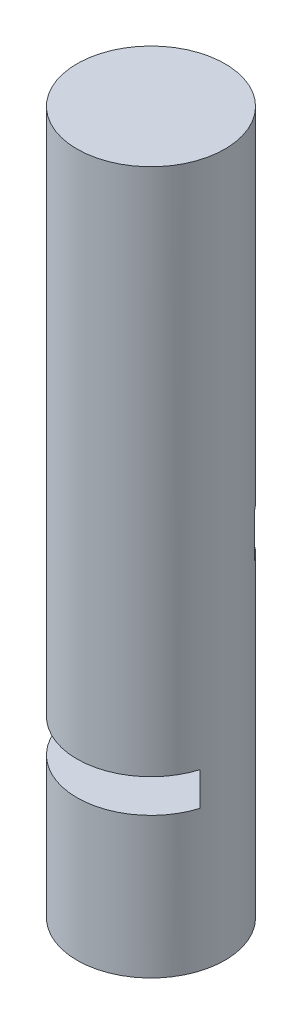
ISO-10303-21;
HEADER;
FILE_DESCRIPTION(('STEP AP214'),'2;1');
FILE_NAME('part.step','',(''),(''),'','','');
FILE_SCHEMA(('AUTOMOTIVE_DESIGN { 1 0 10303 214 1 1 1 1 }'));
ENDSEC;
DATA;
#1=APPLICATION_CONTEXT('core data for automotive mechanical design processes');
#2=APPLICATION_PROTOCOL_DEFINITION('international standard','automotive_design',2000,#1);
#3=PRODUCT_CONTEXT('',#1,'mechanical');
#4=PRODUCT('Part','Part','',(#3));
#5=PRODUCT_RELATED_PRODUCT_CATEGORY('part','',(#4));
#6=PRODUCT_DEFINITION_FORMATION('','',#4);
#7=PRODUCT_DEFINITION_CONTEXT('part definition',#1,'design');
#8=PRODUCT_DEFINITION('design','',#6,#7);
#9=PRODUCT_DEFINITION_SHAPE('','',#8);
#10=(LENGTH_UNIT() NAMED_UNIT(*) SI_UNIT(.MILLI.,.METRE.));
#11=(NAMED_UNIT(*) PLANE_ANGLE_UNIT() SI_UNIT($,.RADIAN.));
#12=(NAMED_UNIT(*) SI_UNIT($,.STERADIAN.) SOLID_ANGLE_UNIT());
#13=UNCERTAINTY_MEASURE_WITH_UNIT(LENGTH_MEASURE(1.E-05),#10,'distance_accuracy_value','');
#14=(GEOMETRIC_REPRESENTATION_CONTEXT(3) GLOBAL_UNCERTAINTY_ASSIGNED_CONTEXT((#13)) GLOBAL_UNIT_ASSIGNED_CONTEXT((#10,
#11,#12)) REPRESENTATION_CONTEXT('',''));
#15=CARTESIAN_POINT('',(0.,0.,0.));
#16=DIRECTION('',(0.,0.,1.));
#17=DIRECTION('',(1.,0.,0.));
#18=AXIS2_PLACEMENT_3D('',#15,#16,#17);
#19=CARTESIAN_POINT('',(0.,80.,0.));
#20=DIRECTION('',(0.,-1.,0.));
#21=DIRECTION('',(0.,0.,-1.));
#22=AXIS2_PLACEMENT_3D('',#19,#20,#21);
#23=CYLINDRICAL_SURFACE('',#22,42.);
#24=DIRECTION('',(0.,-1.,0.));
#25=VECTOR('',#24,1.);
#26=CARTESIAN_POINT('',(-40.15,80.,12.3279154766732));
#27=LINE('',#26,#25);
#28=CARTESIAN_POINT('',(-40.15,80.,12.3279154766732));
#29=VERTEX_POINT('',#28);
#30=CARTESIAN_POINT('',(-40.15,99.,12.3279154766732));
#31=VERTEX_POINT('',#30);
#32=EDGE_CURVE('E159',#29,#31,#27,.F.);
#33=ORIENTED_EDGE('',*,*,#32,.T.);
#34=CARTESIAN_POINT('',(0.,99.,0.));
#35=DIRECTION('',(0.,1.,0.));
#36=DIRECTION('',(0.,0.,1.));
#37=AXIS2_PLACEMENT_3D('',#34,#35,#36);
#38=CIRCLE('',#37,42.);
#39=CARTESIAN_POINT('',(40.15,99.,12.3279154766732));
#40=VERTEX_POINT('',#39);
#41=EDGE_CURVE('E141',#31,#40,#38,.T.);
#42=ORIENTED_EDGE('',*,*,#41,.T.);
#43=DIRECTION('',(0.,-1.,0.));
#44=VECTOR('',#43,1.);
#45=CARTESIAN_POINT('',(40.15,80.,12.3279154766732));
#46=LINE('',#45,#44);
#47=CARTESIAN_POINT('',(40.15,80.,12.3279154766732));
#48=VERTEX_POINT('',#47);
#49=EDGE_CURVE('E165',#40,#48,#46,.T.);
#50=ORIENTED_EDGE('',*,*,#49,.T.);
#51=CARTESIAN_POINT('',(0.,80.,0.));
#52=DIRECTION('',(0.,1.,0.));
#53=DIRECTION('',(0.,0.,1.));
#54=AXIS2_PLACEMENT_3D('',#51,#52,#53);
#55=CIRCLE('',#54,42.);
#56=EDGE_CURVE('E168',#29,#48,#55,.T.);
#57=ORIENTED_EDGE('',*,*,#56,.F.);
#58=EDGE_LOOP('',(#33,#42,#50,#57));
#59=FACE_BOUND('',#58,.T.);
#60=CARTESIAN_POINT('',(0.,0.,0.));
#61=DIRECTION('',(0.,1.,0.));
#62=DIRECTION('',(0.,0.,1.));
#63=AXIS2_PLACEMENT_3D('',#60,#61,#62);
#64=CIRCLE('',#63,42.);
#65=CARTESIAN_POINT('',(0.,0.,42.));
#66=VERTEX_POINT('',#65);
#67=EDGE_CURVE('E11',#66,#66,#64,.T.);
#68=ORIENTED_EDGE('',*,*,#67,.T.);
#69=EDGE_LOOP('',(#68));
#70=FACE_BOUND('',#69,.T.);
#71=CARTESIAN_POINT('',(0.,179.,0.));
#72=DIRECTION('',(0.,1.,0.));
#73=DIRECTION('',(0.,0.,1.));
#74=AXIS2_PLACEMENT_3D('',#71,#72,#73);
#75=CIRCLE('',#74,42.);
#76=CARTESIAN_POINT('',(34.,179.,-24.6576560118759));
#77=VERTEX_POINT('',#76);
#78=CARTESIAN_POINT('',(-34.,179.,-24.6576560118759));
#79=VERTEX_POINT('',#78);
#80=EDGE_CURVE('E126',#77,#79,#75,.T.);
#81=ORIENTED_EDGE('',*,*,#80,.F.);
#82=DIRECTION('',(0.,-1.,0.));
#83=VECTOR('',#82,1.);
#84=CARTESIAN_POINT('',(34.,80.,-24.6576560118759));
#85=LINE('',#84,#83);
#86=CARTESIAN_POINT('',(34.,204.,-24.6576560118759));
#87=VERTEX_POINT('',#86);
#88=EDGE_CURVE('E118',#77,#87,#85,.F.);
#89=ORIENTED_EDGE('',*,*,#88,.T.);
#90=CARTESIAN_POINT('',(0.,204.,0.));
#91=DIRECTION('',(0.,1.,0.));
#92=DIRECTION('',(0.,0.,1.));
#93=AXIS2_PLACEMENT_3D('',#90,#91,#92);
#94=CIRCLE('',#93,42.);
#95=CARTESIAN_POINT('',(-34.,204.,-24.6576560118759));
#96=VERTEX_POINT('',#95);
#97=EDGE_CURVE('E103',#87,#96,#94,.T.);
#98=ORIENTED_EDGE('',*,*,#97,.T.);
#99=DIRECTION('',(0.,-1.,0.));
#100=VECTOR('',#99,1.);
#101=CARTESIAN_POINT('',(-34.,80.,-24.6576560118759));
#102=LINE('',#101,#100);
#103=EDGE_CURVE('E130',#96,#79,#102,.T.);
#104=ORIENTED_EDGE('',*,*,#103,.T.);
#105=EDGE_LOOP('',(#81,#89,#98,#104));
#106=FACE_BOUND('',#105,.T.);
#107=CARTESIAN_POINT('',(0.,399.,0.));
#108=DIRECTION('',(0.,1.,0.));
#109=DIRECTION('',(0.,0.,1.));
#110=AXIS2_PLACEMENT_3D('',#107,#108,#109);
#111=CIRCLE('',#110,42.);
#112=CARTESIAN_POINT('',(0.,399.,42.));
#113=VERTEX_POINT('',#112);
#114=EDGE_CURVE('E114',#113,#113,#111,.T.);
#115=ORIENTED_EDGE('',*,*,#114,.F.);
#116=EDGE_LOOP('',(#115));
#117=FACE_BOUND('',#116,.T.);
#118=ADVANCED_FACE('F38',(#59,#70,#106,#117),#23,.T.);
#119=CARTESIAN_POINT('',(0.,0.,0.));
#120=DIRECTION('',(0.,1.,0.));
#121=DIRECTION('',(0.,0.,1.));
#122=AXIS2_PLACEMENT_3D('',#119,#120,#121);
#123=PLANE('',#122);
#124=ORIENTED_EDGE('',*,*,#67,.F.);
#125=EDGE_LOOP('',(#124));
#126=FACE_BOUND('',#125,.T.);
#127=ADVANCED_FACE('F202',(#126),#123,.F.);
#128=CARTESIAN_POINT('',(0.,80.,0.));
#129=DIRECTION('',(0.,1.,0.));
#130=DIRECTION('',(0.,0.,1.));
#131=AXIS2_PLACEMENT_3D('',#128,#129,#130);
#132=CYLINDRICAL_SURFACE('',#131,40.2);
#133=CARTESIAN_POINT('',(0.,99.,0.));
#134=DIRECTION('',(0.,1.,0.));
#135=DIRECTION('',(0.,0.,1.));
#136=AXIS2_PLACEMENT_3D('',#133,#134,#135);
#137=CIRCLE('',#136,40.2);
#138=CARTESIAN_POINT('',(40.15,99.,2.00437022528264));
#139=VERTEX_POINT('',#138);
#140=CARTESIAN_POINT('',(-40.15,99.,2.00437022528264));
#141=VERTEX_POINT('',#140);
#142=EDGE_CURVE('E170',#139,#141,#137,.T.);
#143=ORIENTED_EDGE('',*,*,#142,.T.);
#144=DIRECTION('',(0.,1.,0.));
#145=VECTOR('',#144,1.);
#146=CARTESIAN_POINT('',(-40.15,80.,2.00437022528264));
#147=LINE('',#146,#145);
#148=CARTESIAN_POINT('',(-40.15,80.,2.00437022528264));
#149=VERTEX_POINT('',#148);
#150=EDGE_CURVE('E152',#141,#149,#147,.F.);
#151=ORIENTED_EDGE('',*,*,#150,.T.);
#152=CARTESIAN_POINT('',(0.,80.,0.));
#153=DIRECTION('',(0.,1.,0.));
#154=DIRECTION('',(0.,0.,1.));
#155=AXIS2_PLACEMENT_3D('',#152,#153,#154);
#156=CIRCLE('',#155,40.2);
#157=CARTESIAN_POINT('',(40.15,80.,2.00437022528264));
#158=VERTEX_POINT('',#157);
#159=EDGE_CURVE('E46',#158,#149,#156,.T.);
#160=ORIENTED_EDGE('',*,*,#159,.F.);
#161=DIRECTION('',(0.,1.,0.));
#162=VECTOR('',#161,1.);
#163=CARTESIAN_POINT('',(40.15,80.,2.00437022528264));
#164=LINE('',#163,#162);
#165=EDGE_CURVE('E162',#158,#139,#164,.T.);
#166=ORIENTED_EDGE('',*,*,#165,.T.);
#167=EDGE_LOOP('',(#143,#151,#160,#166));
#168=FACE_BOUND('',#167,.T.);
#169=ADVANCED_FACE('F174',(#168),#132,.F.);
#170=CARTESIAN_POINT('',(0.,80.,0.));
#171=DIRECTION('',(0.,1.,0.));
#172=DIRECTION('',(0.,0.,1.));
#173=AXIS2_PLACEMENT_3D('',#170,#171,#172);
#174=PLANE('',#173);
#175=ORIENTED_EDGE('',*,*,#159,.T.);
#176=DIRECTION('',(0.,0.,1.));
#177=VECTOR('',#176,1.);
#178=CARTESIAN_POINT('',(-40.15,80.,-2.00437022528263));
#179=LINE('',#178,#177);
#180=EDGE_CURVE('E147',#149,#29,#179,.T.);
#181=ORIENTED_EDGE('',*,*,#180,.T.);
#182=ORIENTED_EDGE('',*,*,#56,.T.);
#183=DIRECTION('',(0.,0.,-1.));
#184=VECTOR('',#183,1.);
#185=CARTESIAN_POINT('',(40.15,80.,64.9956297747174));
#186=LINE('',#185,#184);
#187=EDGE_CURVE('E61',#48,#158,#186,.T.);
#188=ORIENTED_EDGE('',*,*,#187,.T.);
#189=EDGE_LOOP('',(#175,#181,#182,#188));
#190=FACE_BOUND('',#189,.T.);
#191=ADVANCED_FACE('F181',(#190),#174,.T.);
#192=CARTESIAN_POINT('',(40.15,80.,64.9956297747174));
#193=DIRECTION('',(1.,0.,0.));
#194=DIRECTION('',(0.,0.,-1.));
#195=AXIS2_PLACEMENT_3D('',#192,#193,#194);
#196=PLANE('',#195);
#197=DIRECTION('',(0.,0.,-1.));
#198=VECTOR('',#197,1.);
#199=CARTESIAN_POINT('',(40.15,99.,64.9956297747174));
#200=LINE('',#199,#198);
#201=EDGE_CURVE('E150',#40,#139,#200,.T.);
#202=ORIENTED_EDGE('',*,*,#201,.T.);
#203=ORIENTED_EDGE('',*,*,#165,.F.);
#204=ORIENTED_EDGE('',*,*,#187,.F.);
#205=ORIENTED_EDGE('',*,*,#49,.F.);
#206=EDGE_LOOP('',(#202,#203,#204,#205));
#207=FACE_BOUND('',#206,.T.);
#208=ADVANCED_FACE('F186',(#207),#196,.F.);
#209=CARTESIAN_POINT('',(-40.15,80.,-2.00437022528263));
#210=DIRECTION('',(-1.,0.,0.));
#211=DIRECTION('',(0.,0.,1.));
#212=AXIS2_PLACEMENT_3D('',#209,#210,#211);
#213=PLANE('',#212);
#214=ORIENTED_EDGE('',*,*,#180,.F.);
#215=ORIENTED_EDGE('',*,*,#150,.F.);
#216=DIRECTION('',(0.,0.,1.));
#217=VECTOR('',#216,1.);
#218=CARTESIAN_POINT('',(-40.15,99.,-2.00437022528263));
#219=LINE('',#218,#217);
#220=EDGE_CURVE('E146',#141,#31,#219,.T.);
#221=ORIENTED_EDGE('',*,*,#220,.T.);
#222=ORIENTED_EDGE('',*,*,#32,.F.);
#223=EDGE_LOOP('',(#214,#215,#221,#222));
#224=FACE_BOUND('',#223,.T.);
#225=ADVANCED_FACE('F179',(#224),#213,.F.);
#226=CARTESIAN_POINT('',(0.,99.,0.));
#227=DIRECTION('',(0.,1.,0.));
#228=DIRECTION('',(0.,0.,1.));
#229=AXIS2_PLACEMENT_3D('',#226,#227,#228);
#230=PLANE('',#229);
#231=ORIENTED_EDGE('',*,*,#201,.F.);
#232=ORIENTED_EDGE('',*,*,#41,.F.);
#233=ORIENTED_EDGE('',*,*,#220,.F.);
#234=ORIENTED_EDGE('',*,*,#142,.F.);
#235=EDGE_LOOP('',(#231,#232,#233,#234));
#236=FACE_BOUND('',#235,.T.);
#237=ADVANCED_FACE('F187',(#236),#230,.F.);
#238=CARTESIAN_POINT('',(0.,179.,0.));
#239=DIRECTION('',(0.,1.,0.));
#240=DIRECTION('',(0.,0.,1.));
#241=AXIS2_PLACEMENT_3D('',#238,#239,#240);
#242=CYLINDRICAL_SURFACE('',#241,40.2);
#243=CARTESIAN_POINT('',(0.,204.,0.));
#244=DIRECTION('',(0.,1.,0.));
#245=DIRECTION('',(0.,0.,1.));
#246=AXIS2_PLACEMENT_3D('',#243,#244,#245);
#247=CIRCLE('',#246,40.2);
#248=CARTESIAN_POINT('',(-34.,204.,-21.4485430740645));
#249=VERTEX_POINT('',#248);
#250=CARTESIAN_POINT('',(34.,204.,-21.4485430740645));
#251=VERTEX_POINT('',#250);
#252=EDGE_CURVE('E128',#249,#251,#247,.T.);
#253=ORIENTED_EDGE('',*,*,#252,.T.);
#254=DIRECTION('',(0.,1.,0.));
#255=VECTOR('',#254,1.);
#256=CARTESIAN_POINT('',(34.,179.,-21.4485430740645));
#257=LINE('',#256,#255);
#258=CARTESIAN_POINT('',(34.,179.,-21.4485430740645));
#259=VERTEX_POINT('',#258);
#260=EDGE_CURVE('E121',#251,#259,#257,.F.);
#261=ORIENTED_EDGE('',*,*,#260,.T.);
#262=CARTESIAN_POINT('',(0.,179.,0.));
#263=DIRECTION('',(0.,1.,0.));
#264=DIRECTION('',(0.,0.,1.));
#265=AXIS2_PLACEMENT_3D('',#262,#263,#264);
#266=CIRCLE('',#265,40.2);
#267=CARTESIAN_POINT('',(-34.,179.,-21.4485430740645));
#268=VERTEX_POINT('',#267);
#269=EDGE_CURVE('E134',#268,#259,#266,.T.);
#270=ORIENTED_EDGE('',*,*,#269,.F.);
#271=DIRECTION('',(0.,1.,0.));
#272=VECTOR('',#271,1.);
#273=CARTESIAN_POINT('',(-34.,179.,-21.4485430740645));
#274=LINE('',#273,#272);
#275=EDGE_CURVE('E394',#268,#249,#274,.T.);
#276=ORIENTED_EDGE('',*,*,#275,.T.);
#277=EDGE_LOOP('',(#253,#261,#270,#276));
#278=FACE_BOUND('',#277,.T.);
#279=ADVANCED_FACE('F189',(#278),#242,.F.);
#280=CARTESIAN_POINT('',(0.,179.,0.));
#281=DIRECTION('',(0.,1.,0.));
#282=DIRECTION('',(0.,0.,1.));
#283=AXIS2_PLACEMENT_3D('',#280,#281,#282);
#284=PLANE('',#283);
#285=ORIENTED_EDGE('',*,*,#269,.T.);
#286=DIRECTION('',(0.,0.,-1.));
#287=VECTOR('',#286,1.);
#288=CARTESIAN_POINT('',(34.,179.,14.));
#289=LINE('',#288,#287);
#290=EDGE_CURVE('E392',#259,#77,#289,.T.);
#291=ORIENTED_EDGE('',*,*,#290,.T.);
#292=ORIENTED_EDGE('',*,*,#80,.T.);
#293=DIRECTION('',(0.,0.,1.));
#294=VECTOR('',#293,1.);
#295=CARTESIAN_POINT('',(-34.,179.,-50.));
#296=LINE('',#295,#294);
#297=EDGE_CURVE('E53',#79,#268,#296,.T.);
#298=ORIENTED_EDGE('',*,*,#297,.T.);
#299=EDGE_LOOP('',(#285,#291,#292,#298));
#300=FACE_BOUND('',#299,.T.);
#301=ADVANCED_FACE('F195',(#300),#284,.T.);
#302=CARTESIAN_POINT('',(34.,179.,14.));
#303=DIRECTION('',(1.,0.,0.));
#304=DIRECTION('',(0.,0.,-1.));
#305=AXIS2_PLACEMENT_3D('',#302,#303,#304);
#306=PLANE('',#305);
#307=ORIENTED_EDGE('',*,*,#290,.F.);
#308=ORIENTED_EDGE('',*,*,#260,.F.);
#309=DIRECTION('',(0.,0.,-1.));
#310=VECTOR('',#309,1.);
#311=CARTESIAN_POINT('',(34.,204.,14.));
#312=LINE('',#311,#310);
#313=EDGE_CURVE('E106',#251,#87,#312,.T.);
#314=ORIENTED_EDGE('',*,*,#313,.T.);
#315=ORIENTED_EDGE('',*,*,#88,.F.);
#316=EDGE_LOOP('',(#307,#308,#314,#315));
#317=FACE_BOUND('',#316,.T.);
#318=ADVANCED_FACE('F117',(#317),#306,.F.);
#319=CARTESIAN_POINT('',(-34.,179.,-50.));
#320=DIRECTION('',(-1.,0.,0.));
#321=DIRECTION('',(0.,0.,1.));
#322=AXIS2_PLACEMENT_3D('',#319,#320,#321);
#323=PLANE('',#322);
#324=DIRECTION('',(0.,0.,1.));
#325=VECTOR('',#324,1.);
#326=CARTESIAN_POINT('',(-34.,204.,-50.));
#327=LINE('',#326,#325);
#328=EDGE_CURVE('E109',#96,#249,#327,.T.);
#329=ORIENTED_EDGE('',*,*,#328,.T.);
#330=ORIENTED_EDGE('',*,*,#275,.F.);
#331=ORIENTED_EDGE('',*,*,#297,.F.);
#332=ORIENTED_EDGE('',*,*,#103,.F.);
#333=EDGE_LOOP('',(#329,#330,#331,#332));
#334=FACE_BOUND('',#333,.T.);
#335=ADVANCED_FACE('F292',(#334),#323,.F.);
#336=CARTESIAN_POINT('',(0.,204.,0.));
#337=DIRECTION('',(0.,1.,0.));
#338=DIRECTION('',(0.,0.,1.));
#339=AXIS2_PLACEMENT_3D('',#336,#337,#338);
#340=PLANE('',#339);
#341=ORIENTED_EDGE('',*,*,#313,.F.);
#342=ORIENTED_EDGE('',*,*,#252,.F.);
#343=ORIENTED_EDGE('',*,*,#328,.F.);
#344=ORIENTED_EDGE('',*,*,#97,.F.);
#345=EDGE_LOOP('',(#341,#342,#343,#344));
#346=FACE_BOUND('',#345,.T.);
#347=ADVANCED_FACE('F105',(#346),#340,.F.);
#348=CARTESIAN_POINT('',(0.,399.,0.));
#349=DIRECTION('',(0.,1.,0.));
#350=DIRECTION('',(0.,0.,1.));
#351=AXIS2_PLACEMENT_3D('',#348,#349,#350);
#352=PLANE('',#351);
#353=ORIENTED_EDGE('',*,*,#114,.T.);
#354=EDGE_LOOP('',(#353));
#355=FACE_BOUND('',#354,.T.);
#356=ADVANCED_FACE('F312',(#355),#352,.T.);
#357=CLOSED_SHELL('',(#118,#127,#169,#191,#208,#225,#237,#279,#301,#318,#335,#347,#356));
#358=CARTESIAN_POINT('',(0.,119.,0.));
#359=DIRECTION('',(0.,1.,0.));
#360=DIRECTION('',(0.,0.,1.));
#361=AXIS2_PLACEMENT_3D('',#358,#359,#360);
#362=PLANE('',#361);
#363=CARTESIAN_POINT('',(0.,119.,0.));
#364=DIRECTION('',(0.,1.,0.));
#365=DIRECTION('',(0.,0.,1.));
#366=AXIS2_PLACEMENT_3D('',#363,#364,#365);
#367=CIRCLE('',#366,40.2);
#368=CARTESIAN_POINT('',(0.,119.,40.2));
#369=VERTEX_POINT('',#368);
#370=EDGE_CURVE('E138',#369,#369,#367,.T.);
#371=ORIENTED_EDGE('',*,*,#370,.T.);
#372=EDGE_LOOP('',(#371));
#373=FACE_BOUND('',#372,.T.);
#374=ADVANCED_FACE('F243',(#373),#362,.T.);
#375=CARTESIAN_POINT('',(0.,119.,0.));
#376=DIRECTION('',(0.,1.,0.));
#377=DIRECTION('',(0.,0.,1.));
#378=AXIS2_PLACEMENT_3D('',#375,#376,#377);
#379=CYLINDRICAL_SURFACE('',#378,40.2);
#380=ORIENTED_EDGE('',*,*,#370,.F.);
#381=EDGE_LOOP('',(#380));
#382=FACE_BOUND('',#381,.T.);
#383=CARTESIAN_POINT('',(0.,169.,0.));
#384=DIRECTION('',(0.,1.,0.));
#385=DIRECTION('',(0.,0.,1.));
#386=AXIS2_PLACEMENT_3D('',#383,#384,#385);
#387=CIRCLE('',#386,40.2);
#388=CARTESIAN_POINT('',(0.,169.,40.2));
#389=VERTEX_POINT('',#388);
#390=EDGE_CURVE('E136',#389,#389,#387,.T.);
#391=ORIENTED_EDGE('',*,*,#390,.T.);
#392=EDGE_LOOP('',(#391));
#393=FACE_BOUND('',#392,.T.);
#394=ADVANCED_FACE('F237',(#382,#393),#379,.F.);
#395=CARTESIAN_POINT('',(0.,169.,0.));
#396=DIRECTION('',(0.,1.,0.));
#397=DIRECTION('',(0.,0.,1.));
#398=AXIS2_PLACEMENT_3D('',#395,#396,#397);
#399=PLANE('',#398);
#400=ORIENTED_EDGE('',*,*,#390,.F.);
#401=EDGE_LOOP('',(#400));
#402=FACE_BOUND('',#401,.T.);
#403=ADVANCED_FACE('F242',(#402),#399,.F.);
#404=CLOSED_SHELL('',(#374,#394,#403));
#405=ORIENTED_CLOSED_SHELL('',*,#404,.T.);
#406=BREP_WITH_VOIDS('B2',#357,(#405));
#407=ADVANCED_BREP_SHAPE_REPRESENTATION('',(#18,#406),#14);
#408=SHAPE_DEFINITION_REPRESENTATION(#9,#407);
ENDSEC;
END-ISO-10303-21;
